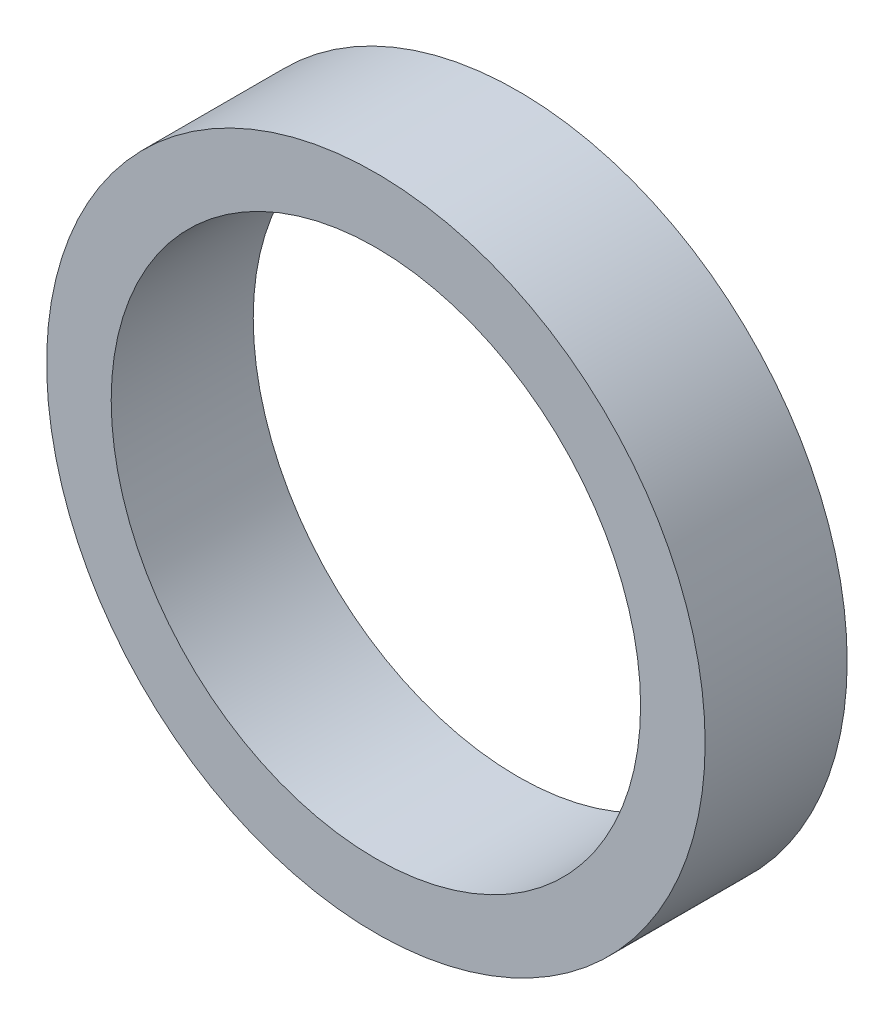
ISO-10303-21;
HEADER;
FILE_DESCRIPTION(('STEP AP214'),'2;1');
FILE_NAME('part.step','',(''),(''),'','','');
FILE_SCHEMA(('AUTOMOTIVE_DESIGN { 1 0 10303 214 1 1 1 1 }'));
ENDSEC;
DATA;
#1=APPLICATION_CONTEXT('core data for automotive mechanical design processes');
#2=APPLICATION_PROTOCOL_DEFINITION('international standard','automotive_design',2000,#1);
#3=PRODUCT_CONTEXT('',#1,'mechanical');
#4=PRODUCT('Part','Part','',(#3));
#5=PRODUCT_RELATED_PRODUCT_CATEGORY('part','',(#4));
#6=PRODUCT_DEFINITION_FORMATION('','',#4);
#7=PRODUCT_DEFINITION_CONTEXT('part definition',#1,'design');
#8=PRODUCT_DEFINITION('design','',#6,#7);
#9=PRODUCT_DEFINITION_SHAPE('','',#8);
#10=(LENGTH_UNIT() NAMED_UNIT(*) SI_UNIT(.MILLI.,.METRE.));
#11=(NAMED_UNIT(*) PLANE_ANGLE_UNIT() SI_UNIT($,.RADIAN.));
#12=(NAMED_UNIT(*) SI_UNIT($,.STERADIAN.) SOLID_ANGLE_UNIT());
#13=UNCERTAINTY_MEASURE_WITH_UNIT(LENGTH_MEASURE(1.E-05),#10,'distance_accuracy_value','');
#14=(GEOMETRIC_REPRESENTATION_CONTEXT(3) GLOBAL_UNCERTAINTY_ASSIGNED_CONTEXT((#13)) GLOBAL_UNIT_ASSIGNED_CONTEXT((#10,
#11,#12)) REPRESENTATION_CONTEXT('',''));
#15=CARTESIAN_POINT('',(0.,0.,0.));
#16=DIRECTION('',(0.,0.,1.));
#17=DIRECTION('',(1.,0.,0.));
#18=AXIS2_PLACEMENT_3D('',#15,#16,#17);
#19=CARTESIAN_POINT('',(0.,0.,11.));
#20=DIRECTION('',(0.,0.,1.));
#21=DIRECTION('',(1.,0.,0.));
#22=AXIS2_PLACEMENT_3D('',#19,#20,#21);
#23=PLANE('',#22);
#24=CARTESIAN_POINT('',(0.,0.,11.));
#25=DIRECTION('',(0.,0.,1.));
#26=DIRECTION('',(1.,0.,0.));
#27=AXIS2_PLACEMENT_3D('',#24,#25,#26);
#28=CIRCLE('',#27,25.5);
#29=CARTESIAN_POINT('',(25.5,0.,11.));
#30=VERTEX_POINT('',#29);
#31=EDGE_CURVE('E10',#30,#30,#28,.T.);
#32=ORIENTED_EDGE('',*,*,#31,.T.);
#33=EDGE_LOOP('',(#32));
#34=FACE_BOUND('',#33,.T.);
#35=CARTESIAN_POINT('',(0.,0.,11.));
#36=DIRECTION('',(0.,0.,1.));
#37=DIRECTION('',(1.,0.,0.));
#38=AXIS2_PLACEMENT_3D('',#35,#36,#37);
#39=CIRCLE('',#38,20.5);
#40=CARTESIAN_POINT('',(20.5,0.,11.));
#41=VERTEX_POINT('',#40);
#42=EDGE_CURVE('E43',#41,#41,#39,.T.);
#43=ORIENTED_EDGE('',*,*,#42,.F.);
#44=EDGE_LOOP('',(#43));
#45=FACE_BOUND('',#44,.T.);
#46=ADVANCED_FACE('F32',(#34,#45),#23,.T.);
#47=CARTESIAN_POINT('',(0.,0.,0.));
#48=DIRECTION('',(0.,0.,1.));
#49=DIRECTION('',(1.,0.,0.));
#50=AXIS2_PLACEMENT_3D('',#47,#48,#49);
#51=PLANE('',#50);
#52=CARTESIAN_POINT('',(0.,0.,0.));
#53=DIRECTION('',(0.,0.,1.));
#54=DIRECTION('',(1.,0.,0.));
#55=AXIS2_PLACEMENT_3D('',#52,#53,#54);
#56=CIRCLE('',#55,25.5);
#57=CARTESIAN_POINT('',(25.5,0.,0.));
#58=VERTEX_POINT('',#57);
#59=EDGE_CURVE('E36',#58,#58,#56,.T.);
#60=ORIENTED_EDGE('',*,*,#59,.F.);
#61=EDGE_LOOP('',(#60));
#62=FACE_BOUND('',#61,.T.);
#63=CARTESIAN_POINT('',(0.,0.,0.));
#64=DIRECTION('',(0.,0.,1.));
#65=DIRECTION('',(1.,0.,0.));
#66=AXIS2_PLACEMENT_3D('',#63,#64,#65);
#67=CIRCLE('',#66,20.5);
#68=CARTESIAN_POINT('',(20.5,0.,0.));
#69=VERTEX_POINT('',#68);
#70=EDGE_CURVE('E45',#69,#69,#67,.T.);
#71=ORIENTED_EDGE('',*,*,#70,.T.);
#72=EDGE_LOOP('',(#71));
#73=FACE_BOUND('',#72,.T.);
#74=ADVANCED_FACE('F55',(#62,#73),#51,.F.);
#75=CARTESIAN_POINT('',(0.,0.,11.));
#76=DIRECTION('',(0.,0.,-1.));
#77=DIRECTION('',(-1.,0.,0.));
#78=AXIS2_PLACEMENT_3D('',#75,#76,#77);
#79=CYLINDRICAL_SURFACE('',#78,25.5);
#80=ORIENTED_EDGE('',*,*,#31,.F.);
#81=EDGE_LOOP('',(#80));
#82=FACE_BOUND('',#81,.T.);
#83=ORIENTED_EDGE('',*,*,#59,.T.);
#84=EDGE_LOOP('',(#83));
#85=FACE_BOUND('',#84,.T.);
#86=ADVANCED_FACE('F34',(#82,#85),#79,.T.);
#87=CARTESIAN_POINT('',(0.,0.,11.));
#88=DIRECTION('',(0.,0.,-1.));
#89=DIRECTION('',(-1.,0.,0.));
#90=AXIS2_PLACEMENT_3D('',#87,#88,#89);
#91=CYLINDRICAL_SURFACE('',#90,20.5);
#92=ORIENTED_EDGE('',*,*,#42,.T.);
#93=EDGE_LOOP('',(#92));
#94=FACE_BOUND('',#93,.T.);
#95=ORIENTED_EDGE('',*,*,#70,.F.);
#96=EDGE_LOOP('',(#95));
#97=FACE_BOUND('',#96,.T.);
#98=ADVANCED_FACE('F51',(#94,#97),#91,.F.);
#99=CLOSED_SHELL('',(#46,#74,#86,#98));
#100=MANIFOLD_SOLID_BREP('B2',#99);
#101=ADVANCED_BREP_SHAPE_REPRESENTATION('',(#18,#100),#14);
#102=SHAPE_DEFINITION_REPRESENTATION(#9,#101);
ENDSEC;
END-ISO-10303-21;
